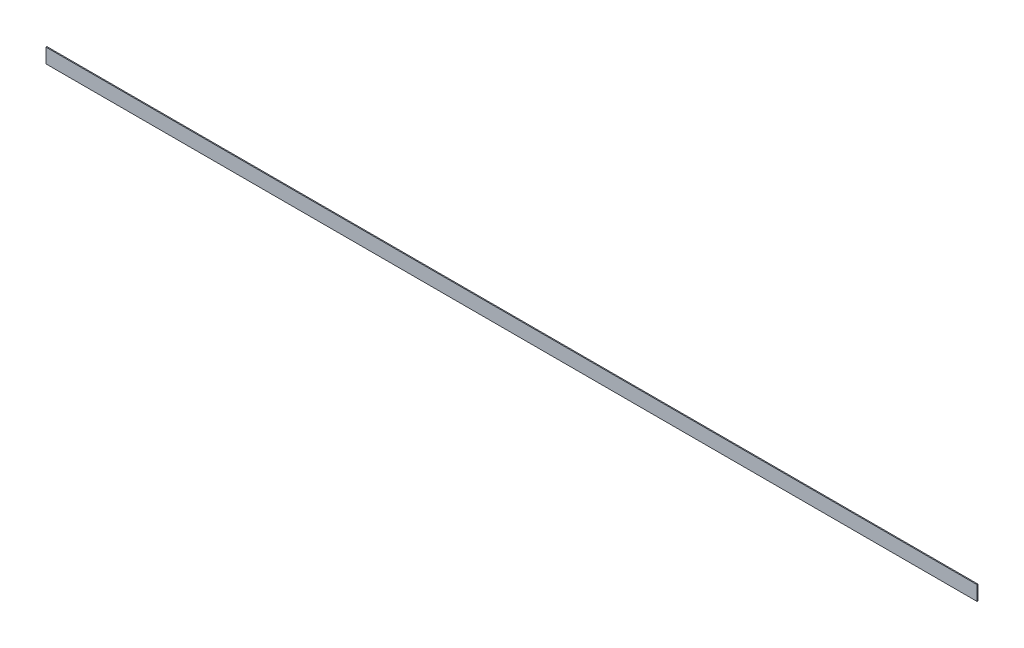
ISO-10303-21;
HEADER;
FILE_DESCRIPTION(('STEP AP214'),'2;1');
FILE_NAME('part.step','',(''),(''),'','','');
FILE_SCHEMA(('AUTOMOTIVE_DESIGN { 1 0 10303 214 1 1 1 1 }'));
ENDSEC;
DATA;
#1=APPLICATION_CONTEXT('core data for automotive mechanical design processes');
#2=APPLICATION_PROTOCOL_DEFINITION('international standard','automotive_design',2000,#1);
#3=PRODUCT_CONTEXT('',#1,'mechanical');
#4=PRODUCT('Part','Part','',(#3));
#5=PRODUCT_RELATED_PRODUCT_CATEGORY('part','',(#4));
#6=PRODUCT_DEFINITION_FORMATION('','',#4);
#7=PRODUCT_DEFINITION_CONTEXT('part definition',#1,'design');
#8=PRODUCT_DEFINITION('design','',#6,#7);
#9=PRODUCT_DEFINITION_SHAPE('','',#8);
#10=(LENGTH_UNIT() NAMED_UNIT(*) SI_UNIT(.MILLI.,.METRE.));
#11=(NAMED_UNIT(*) PLANE_ANGLE_UNIT() SI_UNIT($,.RADIAN.));
#12=(NAMED_UNIT(*) SI_UNIT($,.STERADIAN.) SOLID_ANGLE_UNIT());
#13=UNCERTAINTY_MEASURE_WITH_UNIT(LENGTH_MEASURE(1.E-05),#10,'distance_accuracy_value','');
#14=(GEOMETRIC_REPRESENTATION_CONTEXT(3) GLOBAL_UNCERTAINTY_ASSIGNED_CONTEXT((#13)) GLOBAL_UNIT_ASSIGNED_CONTEXT((#10,
#11,#12)) REPRESENTATION_CONTEXT('',''));
#15=CARTESIAN_POINT('',(0.,0.,0.));
#16=DIRECTION('',(0.,0.,1.));
#17=DIRECTION('',(1.,0.,0.));
#18=AXIS2_PLACEMENT_3D('',#15,#16,#17);
#19=CARTESIAN_POINT('',(0.,0.,1.27));
#20=DIRECTION('',(1.,0.,0.));
#21=DIRECTION('',(0.,0.,-1.));
#22=AXIS2_PLACEMENT_3D('',#19,#20,#21);
#23=PLANE('',#22);
#24=DIRECTION('',(0.,-1.,0.));
#25=VECTOR('',#24,1.);
#26=CARTESIAN_POINT('',(0.,0.,0.));
#27=LINE('',#26,#25);
#28=CARTESIAN_POINT('',(0.,19.05,0.));
#29=VERTEX_POINT('',#28);
#30=CARTESIAN_POINT('',(0.,0.,0.));
#31=VERTEX_POINT('',#30);
#32=EDGE_CURVE('E100',#29,#31,#27,.T.);
#33=ORIENTED_EDGE('',*,*,#32,.T.);
#34=DIRECTION('',(0.,0.,-1.));
#35=VECTOR('',#34,1.);
#36=CARTESIAN_POINT('',(0.,0.,1.27));
#37=LINE('',#36,#35);
#38=CARTESIAN_POINT('',(0.,0.,1.27));
#39=VERTEX_POINT('',#38);
#40=EDGE_CURVE('E11',#39,#31,#37,.T.);
#41=ORIENTED_EDGE('',*,*,#40,.F.);
#42=DIRECTION('',(0.,-1.,0.));
#43=VECTOR('',#42,1.);
#44=CARTESIAN_POINT('',(0.,0.,1.27));
#45=LINE('',#44,#43);
#46=CARTESIAN_POINT('',(0.,19.05,1.27));
#47=VERTEX_POINT('',#46);
#48=EDGE_CURVE('E88',#47,#39,#45,.T.);
#49=ORIENTED_EDGE('',*,*,#48,.F.);
#50=DIRECTION('',(0.,0.,-1.));
#51=VECTOR('',#50,1.);
#52=CARTESIAN_POINT('',(0.,19.05,1.27));
#53=LINE('',#52,#51);
#54=EDGE_CURVE('E96',#47,#29,#53,.T.);
#55=ORIENTED_EDGE('',*,*,#54,.T.);
#56=EDGE_LOOP('',(#33,#41,#49,#55));
#57=FACE_BOUND('',#56,.T.);
#58=ADVANCED_FACE('F37',(#57),#23,.F.);
#59=CARTESIAN_POINT('',(0.,0.,1.27));
#60=DIRECTION('',(0.,1.,0.));
#61=DIRECTION('',(0.,0.,1.));
#62=AXIS2_PLACEMENT_3D('',#59,#60,#61);
#63=PLANE('',#62);
#64=DIRECTION('',(1.,0.,0.));
#65=VECTOR('',#64,1.);
#66=CARTESIAN_POINT('',(0.,0.,0.));
#67=LINE('',#66,#65);
#68=CARTESIAN_POINT('',(1219.2,0.,0.));
#69=VERTEX_POINT('',#68);
#70=EDGE_CURVE('E92',#31,#69,#67,.T.);
#71=ORIENTED_EDGE('',*,*,#70,.T.);
#72=DIRECTION('',(0.,0.,-1.));
#73=VECTOR('',#72,1.);
#74=CARTESIAN_POINT('',(1219.2,0.,1.27));
#75=LINE('',#74,#73);
#76=CARTESIAN_POINT('',(1219.2,0.,1.27));
#77=VERTEX_POINT('',#76);
#78=EDGE_CURVE('E45',#77,#69,#75,.T.);
#79=ORIENTED_EDGE('',*,*,#78,.F.);
#80=DIRECTION('',(1.,0.,0.));
#81=VECTOR('',#80,1.);
#82=CARTESIAN_POINT('',(0.,0.,1.27));
#83=LINE('',#82,#81);
#84=EDGE_CURVE('E83',#39,#77,#83,.T.);
#85=ORIENTED_EDGE('',*,*,#84,.F.);
#86=ORIENTED_EDGE('',*,*,#40,.T.);
#87=EDGE_LOOP('',(#71,#79,#85,#86));
#88=FACE_BOUND('',#87,.T.);
#89=ADVANCED_FACE('F91',(#88),#63,.F.);
#90=CARTESIAN_POINT('',(1219.2,0.,1.27));
#91=DIRECTION('',(-1.,0.,0.));
#92=DIRECTION('',(0.,0.,1.));
#93=AXIS2_PLACEMENT_3D('',#90,#91,#92);
#94=PLANE('',#93);
#95=DIRECTION('',(0.,1.,0.));
#96=VECTOR('',#95,1.);
#97=CARTESIAN_POINT('',(1219.2,0.,0.));
#98=LINE('',#97,#96);
#99=CARTESIAN_POINT('',(1219.2,19.05,0.));
#100=VERTEX_POINT('',#99);
#101=EDGE_CURVE('E70',#69,#100,#98,.T.);
#102=ORIENTED_EDGE('',*,*,#101,.T.);
#103=DIRECTION('',(0.,0.,-1.));
#104=VECTOR('',#103,1.);
#105=CARTESIAN_POINT('',(1219.2,19.05,1.27));
#106=LINE('',#105,#104);
#107=CARTESIAN_POINT('',(1219.2,19.05,1.27));
#108=VERTEX_POINT('',#107);
#109=EDGE_CURVE('E93',#108,#100,#106,.T.);
#110=ORIENTED_EDGE('',*,*,#109,.F.);
#111=DIRECTION('',(0.,1.,0.));
#112=VECTOR('',#111,1.);
#113=CARTESIAN_POINT('',(1219.2,0.,1.27));
#114=LINE('',#113,#112);
#115=EDGE_CURVE('E86',#77,#108,#114,.T.);
#116=ORIENTED_EDGE('',*,*,#115,.F.);
#117=ORIENTED_EDGE('',*,*,#78,.T.);
#118=EDGE_LOOP('',(#102,#110,#116,#117));
#119=FACE_BOUND('',#118,.T.);
#120=ADVANCED_FACE('F94',(#119),#94,.F.);
#121=CARTESIAN_POINT('',(0.,19.05,1.27));
#122=DIRECTION('',(0.,-1.,0.));
#123=DIRECTION('',(0.,0.,-1.));
#124=AXIS2_PLACEMENT_3D('',#121,#122,#123);
#125=PLANE('',#124);
#126=DIRECTION('',(-1.,0.,0.));
#127=VECTOR('',#126,1.);
#128=CARTESIAN_POINT('',(0.,19.05,0.));
#129=LINE('',#128,#127);
#130=EDGE_CURVE('E76',#100,#29,#129,.T.);
#131=ORIENTED_EDGE('',*,*,#130,.T.);
#132=ORIENTED_EDGE('',*,*,#54,.F.);
#133=DIRECTION('',(-1.,0.,0.));
#134=VECTOR('',#133,1.);
#135=CARTESIAN_POINT('',(0.,19.05,1.27));
#136=LINE('',#135,#134);
#137=EDGE_CURVE('E53',#108,#47,#136,.T.);
#138=ORIENTED_EDGE('',*,*,#137,.F.);
#139=ORIENTED_EDGE('',*,*,#109,.T.);
#140=EDGE_LOOP('',(#131,#132,#138,#139));
#141=FACE_BOUND('',#140,.T.);
#142=ADVANCED_FACE('F107',(#141),#125,.F.);
#143=CARTESIAN_POINT('',(0.,0.,1.27));
#144=DIRECTION('',(0.,0.,-1.));
#145=DIRECTION('',(-1.,0.,0.));
#146=AXIS2_PLACEMENT_3D('',#143,#144,#145);
#147=PLANE('',#146);
#148=ORIENTED_EDGE('',*,*,#48,.T.);
#149=ORIENTED_EDGE('',*,*,#84,.T.);
#150=ORIENTED_EDGE('',*,*,#115,.T.);
#151=ORIENTED_EDGE('',*,*,#137,.T.);
#152=EDGE_LOOP('',(#148,#149,#150,#151));
#153=FACE_BOUND('',#152,.T.);
#154=ADVANCED_FACE('F84',(#153),#147,.F.);
#155=CARTESIAN_POINT('',(0.,0.,0.));
#156=DIRECTION('',(0.,0.,-1.));
#157=DIRECTION('',(-1.,0.,0.));
#158=AXIS2_PLACEMENT_3D('',#155,#156,#157);
#159=PLANE('',#158);
#160=ORIENTED_EDGE('',*,*,#32,.F.);
#161=ORIENTED_EDGE('',*,*,#130,.F.);
#162=ORIENTED_EDGE('',*,*,#101,.F.);
#163=ORIENTED_EDGE('',*,*,#70,.F.);
#164=EDGE_LOOP('',(#160,#161,#162,#163));
#165=FACE_BOUND('',#164,.T.);
#166=ADVANCED_FACE('F110',(#165),#159,.T.);
#167=CLOSED_SHELL('',(#58,#89,#120,#142,#154,#166));
#168=MANIFOLD_SOLID_BREP('B2',#167);
#169=ADVANCED_BREP_SHAPE_REPRESENTATION('',(#18,#168),#14);
#170=SHAPE_DEFINITION_REPRESENTATION(#9,#169);
ENDSEC;
END-ISO-10303-21;
